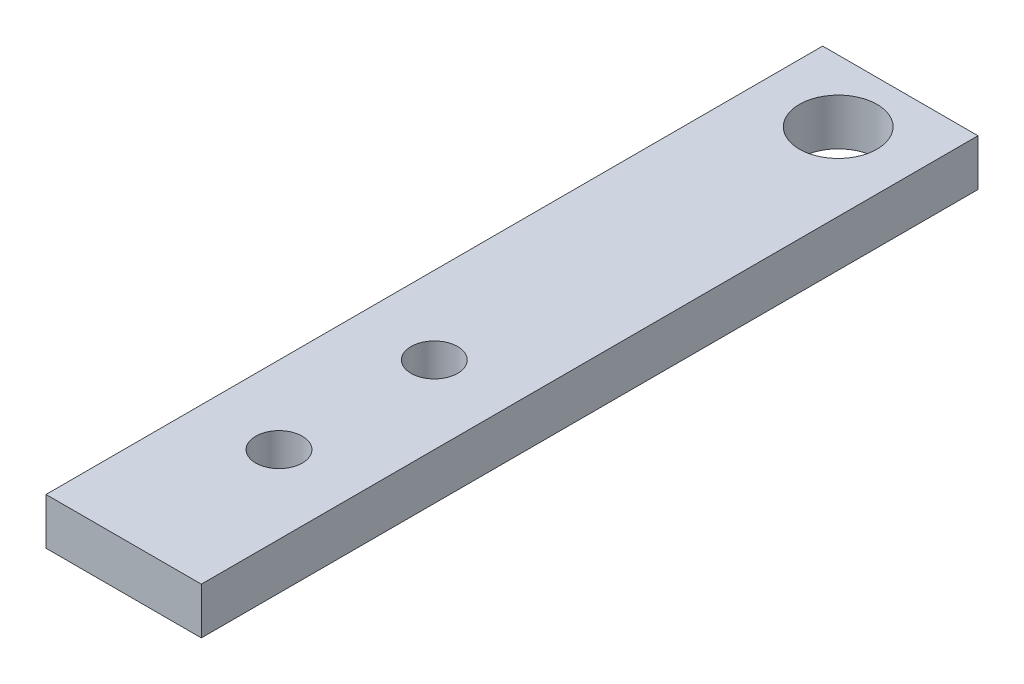
ISO-10303-21;
HEADER;
FILE_DESCRIPTION(('STEP AP214'),'2;1');
FILE_NAME('part.step','',(''),(''),'','','');
FILE_SCHEMA(('AUTOMOTIVE_DESIGN { 1 0 10303 214 1 1 1 1 }'));
ENDSEC;
DATA;
#1=APPLICATION_CONTEXT('core data for automotive mechanical design processes');
#2=APPLICATION_PROTOCOL_DEFINITION('international standard','automotive_design',2000,#1);
#3=PRODUCT_CONTEXT('',#1,'mechanical');
#4=PRODUCT('Part','Part','',(#3));
#5=PRODUCT_RELATED_PRODUCT_CATEGORY('part','',(#4));
#6=PRODUCT_DEFINITION_FORMATION('','',#4);
#7=PRODUCT_DEFINITION_CONTEXT('part definition',#1,'design');
#8=PRODUCT_DEFINITION('design','',#6,#7);
#9=PRODUCT_DEFINITION_SHAPE('','',#8);
#10=(LENGTH_UNIT() NAMED_UNIT(*) SI_UNIT(.MILLI.,.METRE.));
#11=(NAMED_UNIT(*) PLANE_ANGLE_UNIT() SI_UNIT($,.RADIAN.));
#12=(NAMED_UNIT(*) SI_UNIT($,.STERADIAN.) SOLID_ANGLE_UNIT());
#13=UNCERTAINTY_MEASURE_WITH_UNIT(LENGTH_MEASURE(1.E-05),#10,'distance_accuracy_value','');
#14=(GEOMETRIC_REPRESENTATION_CONTEXT(3) GLOBAL_UNCERTAINTY_ASSIGNED_CONTEXT((#13)) GLOBAL_UNIT_ASSIGNED_CONTEXT((#10,
#11,#12)) REPRESENTATION_CONTEXT('',''));
#15=CARTESIAN_POINT('',(0.,0.,0.));
#16=DIRECTION('',(0.,0.,1.));
#17=DIRECTION('',(1.,0.,0.));
#18=AXIS2_PLACEMENT_3D('',#15,#16,#17);
#19=CARTESIAN_POINT('',(0.,3.,0.));
#20=DIRECTION('',(0.,1.,0.));
#21=DIRECTION('',(0.,0.,1.));
#22=AXIS2_PLACEMENT_3D('',#19,#20,#21);
#23=PLANE('',#22);
#24=CARTESIAN_POINT('',(0.,3.,5.));
#25=DIRECTION('',(0.,1.,0.));
#26=DIRECTION('',(0.,0.,1.));
#27=AXIS2_PLACEMENT_3D('',#24,#25,#26);
#28=CIRCLE('',#27,1.5);
#29=CARTESIAN_POINT('',(0.,3.,6.5));
#30=VERTEX_POINT('',#29);
#31=EDGE_CURVE('E117',#30,#30,#28,.T.);
#32=ORIENTED_EDGE('',*,*,#31,.F.);
#33=EDGE_LOOP('',(#32));
#34=FACE_BOUND('',#33,.T.);
#35=DIRECTION('',(0.,0.,-1.));
#36=VECTOR('',#35,1.);
#37=CARTESIAN_POINT('',(5.,3.,-25.));
#38=LINE('',#37,#36);
#39=CARTESIAN_POINT('',(5.,3.,25.));
#40=VERTEX_POINT('',#39);
#41=CARTESIAN_POINT('',(5.,3.,-25.));
#42=VERTEX_POINT('',#41);
#43=EDGE_CURVE('E87',#40,#42,#38,.T.);
#44=ORIENTED_EDGE('',*,*,#43,.T.);
#45=DIRECTION('',(-1.,0.,0.));
#46=VECTOR('',#45,1.);
#47=CARTESIAN_POINT('',(-5.,3.,-25.));
#48=LINE('',#47,#46);
#49=CARTESIAN_POINT('',(-5.,3.,-25.));
#50=VERTEX_POINT('',#49);
#51=EDGE_CURVE('E82',#42,#50,#48,.T.);
#52=ORIENTED_EDGE('',*,*,#51,.T.);
#53=DIRECTION('',(0.,0.,1.));
#54=VECTOR('',#53,1.);
#55=CARTESIAN_POINT('',(-5.,3.,-25.));
#56=LINE('',#55,#54);
#57=CARTESIAN_POINT('',(-5.,3.,25.));
#58=VERTEX_POINT('',#57);
#59=EDGE_CURVE('E85',#50,#58,#56,.T.);
#60=ORIENTED_EDGE('',*,*,#59,.T.);
#61=DIRECTION('',(1.,0.,0.));
#62=VECTOR('',#61,1.);
#63=CARTESIAN_POINT('',(-5.,3.,25.));
#64=LINE('',#63,#62);
#65=EDGE_CURVE('E52',#58,#40,#64,.T.);
#66=ORIENTED_EDGE('',*,*,#65,.T.);
#67=EDGE_LOOP('',(#44,#52,#60,#66));
#68=FACE_BOUND('',#67,.T.);
#69=CARTESIAN_POINT('',(0.,3.,15.));
#70=DIRECTION('',(0.,1.,0.));
#71=DIRECTION('',(0.,0.,1.));
#72=AXIS2_PLACEMENT_3D('',#69,#70,#71);
#73=CIRCLE('',#72,1.5);
#74=CARTESIAN_POINT('',(0.,3.,16.5));
#75=VERTEX_POINT('',#74);
#76=EDGE_CURVE('E102',#75,#75,#73,.T.);
#77=ORIENTED_EDGE('',*,*,#76,.F.);
#78=EDGE_LOOP('',(#77));
#79=FACE_BOUND('',#78,.T.);
#80=CARTESIAN_POINT('',(0.,3.,-21.));
#81=DIRECTION('',(0.,1.,0.));
#82=DIRECTION('',(0.,0.,1.));
#83=AXIS2_PLACEMENT_3D('',#80,#81,#82);
#84=CIRCLE('',#83,2.5);
#85=CARTESIAN_POINT('',(0.,3.,-18.5));
#86=VERTEX_POINT('',#85);
#87=EDGE_CURVE('E123',#86,#86,#84,.T.);
#88=ORIENTED_EDGE('',*,*,#87,.F.);
#89=EDGE_LOOP('',(#88));
#90=FACE_BOUND('',#89,.T.);
#91=ADVANCED_FACE('F35',(#34,#68,#79,#90),#23,.T.);
#92=CARTESIAN_POINT('',(0.,0.,0.));
#93=DIRECTION('',(0.,1.,0.));
#94=DIRECTION('',(0.,0.,1.));
#95=AXIS2_PLACEMENT_3D('',#92,#93,#94);
#96=PLANE('',#95);
#97=CARTESIAN_POINT('',(0.,0.,5.));
#98=DIRECTION('',(0.,1.,0.));
#99=DIRECTION('',(0.,0.,1.));
#100=AXIS2_PLACEMENT_3D('',#97,#98,#99);
#101=CIRCLE('',#100,1.5);
#102=CARTESIAN_POINT('',(0.,0.,6.5));
#103=VERTEX_POINT('',#102);
#104=EDGE_CURVE('E120',#103,#103,#101,.T.);
#105=ORIENTED_EDGE('',*,*,#104,.T.);
#106=EDGE_LOOP('',(#105));
#107=FACE_BOUND('',#106,.T.);
#108=DIRECTION('',(0.,0.,-1.));
#109=VECTOR('',#108,1.);
#110=CARTESIAN_POINT('',(5.,0.,-25.));
#111=LINE('',#110,#109);
#112=CARTESIAN_POINT('',(5.,0.,25.));
#113=VERTEX_POINT('',#112);
#114=CARTESIAN_POINT('',(5.,0.,-25.));
#115=VERTEX_POINT('',#114);
#116=EDGE_CURVE('E99',#113,#115,#111,.T.);
#117=ORIENTED_EDGE('',*,*,#116,.F.);
#118=DIRECTION('',(1.,0.,0.));
#119=VECTOR('',#118,1.);
#120=CARTESIAN_POINT('',(-5.,0.,25.));
#121=LINE('',#120,#119);
#122=CARTESIAN_POINT('',(-5.,0.,25.));
#123=VERTEX_POINT('',#122);
#124=EDGE_CURVE('E75',#123,#113,#121,.T.);
#125=ORIENTED_EDGE('',*,*,#124,.F.);
#126=DIRECTION('',(0.,0.,1.));
#127=VECTOR('',#126,1.);
#128=CARTESIAN_POINT('',(-5.,0.,-25.));
#129=LINE('',#128,#127);
#130=CARTESIAN_POINT('',(-5.,0.,-25.));
#131=VERTEX_POINT('',#130);
#132=EDGE_CURVE('E69',#131,#123,#129,.T.);
#133=ORIENTED_EDGE('',*,*,#132,.F.);
#134=DIRECTION('',(-1.,0.,0.));
#135=VECTOR('',#134,1.);
#136=CARTESIAN_POINT('',(-5.,0.,-25.));
#137=LINE('',#136,#135);
#138=EDGE_CURVE('E91',#115,#131,#137,.T.);
#139=ORIENTED_EDGE('',*,*,#138,.F.);
#140=EDGE_LOOP('',(#117,#125,#133,#139));
#141=FACE_BOUND('',#140,.T.);
#142=CARTESIAN_POINT('',(0.,0.,15.));
#143=DIRECTION('',(0.,1.,0.));
#144=DIRECTION('',(0.,0.,1.));
#145=AXIS2_PLACEMENT_3D('',#142,#143,#144);
#146=CIRCLE('',#145,1.5);
#147=CARTESIAN_POINT('',(0.,0.,16.5));
#148=VERTEX_POINT('',#147);
#149=EDGE_CURVE('E114',#148,#148,#146,.T.);
#150=ORIENTED_EDGE('',*,*,#149,.T.);
#151=EDGE_LOOP('',(#150));
#152=FACE_BOUND('',#151,.T.);
#153=CARTESIAN_POINT('',(0.,0.,-21.));
#154=DIRECTION('',(0.,1.,0.));
#155=DIRECTION('',(0.,0.,1.));
#156=AXIS2_PLACEMENT_3D('',#153,#154,#155);
#157=CIRCLE('',#156,2.5);
#158=CARTESIAN_POINT('',(0.,0.,-18.5));
#159=VERTEX_POINT('',#158);
#160=EDGE_CURVE('E126',#159,#159,#157,.T.);
#161=ORIENTED_EDGE('',*,*,#160,.T.);
#162=EDGE_LOOP('',(#161));
#163=FACE_BOUND('',#162,.T.);
#164=ADVANCED_FACE('F110',(#107,#141,#152,#163),#96,.F.);
#165=CARTESIAN_POINT('',(5.,3.,-25.));
#166=DIRECTION('',(-1.,0.,0.));
#167=DIRECTION('',(0.,0.,1.));
#168=AXIS2_PLACEMENT_3D('',#165,#166,#167);
#169=PLANE('',#168);
#170=ORIENTED_EDGE('',*,*,#116,.T.);
#171=DIRECTION('',(0.,-1.,0.));
#172=VECTOR('',#171,1.);
#173=CARTESIAN_POINT('',(5.,3.,-25.));
#174=LINE('',#173,#172);
#175=EDGE_CURVE('E11',#42,#115,#174,.T.);
#176=ORIENTED_EDGE('',*,*,#175,.F.);
#177=ORIENTED_EDGE('',*,*,#43,.F.);
#178=DIRECTION('',(0.,-1.,0.));
#179=VECTOR('',#178,1.);
#180=CARTESIAN_POINT('',(5.,3.,25.));
#181=LINE('',#180,#179);
#182=EDGE_CURVE('E95',#40,#113,#181,.T.);
#183=ORIENTED_EDGE('',*,*,#182,.T.);
#184=EDGE_LOOP('',(#170,#176,#177,#183));
#185=FACE_BOUND('',#184,.T.);
#186=ADVANCED_FACE('F37',(#185),#169,.F.);
#187=CARTESIAN_POINT('',(-5.,3.,-25.));
#188=DIRECTION('',(0.,0.,1.));
#189=DIRECTION('',(1.,0.,0.));
#190=AXIS2_PLACEMENT_3D('',#187,#188,#189);
#191=PLANE('',#190);
#192=ORIENTED_EDGE('',*,*,#138,.T.);
#193=DIRECTION('',(0.,-1.,0.));
#194=VECTOR('',#193,1.);
#195=CARTESIAN_POINT('',(-5.,3.,-25.));
#196=LINE('',#195,#194);
#197=EDGE_CURVE('E44',#50,#131,#196,.T.);
#198=ORIENTED_EDGE('',*,*,#197,.F.);
#199=ORIENTED_EDGE('',*,*,#51,.F.);
#200=ORIENTED_EDGE('',*,*,#175,.T.);
#201=EDGE_LOOP('',(#192,#198,#199,#200));
#202=FACE_BOUND('',#201,.T.);
#203=ADVANCED_FACE('F90',(#202),#191,.F.);
#204=CARTESIAN_POINT('',(-5.,3.,-25.));
#205=DIRECTION('',(1.,0.,0.));
#206=DIRECTION('',(0.,0.,-1.));
#207=AXIS2_PLACEMENT_3D('',#204,#205,#206);
#208=PLANE('',#207);
#209=ORIENTED_EDGE('',*,*,#132,.T.);
#210=DIRECTION('',(0.,-1.,0.));
#211=VECTOR('',#210,1.);
#212=CARTESIAN_POINT('',(-5.,3.,25.));
#213=LINE('',#212,#211);
#214=EDGE_CURVE('E92',#58,#123,#213,.T.);
#215=ORIENTED_EDGE('',*,*,#214,.F.);
#216=ORIENTED_EDGE('',*,*,#59,.F.);
#217=ORIENTED_EDGE('',*,*,#197,.T.);
#218=EDGE_LOOP('',(#209,#215,#216,#217));
#219=FACE_BOUND('',#218,.T.);
#220=ADVANCED_FACE('F93',(#219),#208,.F.);
#221=CARTESIAN_POINT('',(-5.,3.,25.));
#222=DIRECTION('',(0.,0.,-1.));
#223=DIRECTION('',(-1.,0.,0.));
#224=AXIS2_PLACEMENT_3D('',#221,#222,#223);
#225=PLANE('',#224);
#226=ORIENTED_EDGE('',*,*,#124,.T.);
#227=ORIENTED_EDGE('',*,*,#182,.F.);
#228=ORIENTED_EDGE('',*,*,#65,.F.);
#229=ORIENTED_EDGE('',*,*,#214,.T.);
#230=EDGE_LOOP('',(#226,#227,#228,#229));
#231=FACE_BOUND('',#230,.T.);
#232=ADVANCED_FACE('F107',(#231),#225,.F.);
#233=CARTESIAN_POINT('',(0.,3.,15.));
#234=DIRECTION('',(0.,-1.,0.));
#235=DIRECTION('',(0.,0.,-1.));
#236=AXIS2_PLACEMENT_3D('',#233,#234,#235);
#237=CYLINDRICAL_SURFACE('',#236,1.5);
#238=ORIENTED_EDGE('',*,*,#76,.T.);
#239=EDGE_LOOP('',(#238));
#240=FACE_BOUND('',#239,.T.);
#241=ORIENTED_EDGE('',*,*,#149,.F.);
#242=EDGE_LOOP('',(#241));
#243=FACE_BOUND('',#242,.T.);
#244=ADVANCED_FACE('F145',(#240,#243),#237,.F.);
#245=CARTESIAN_POINT('',(0.,3.,5.));
#246=DIRECTION('',(0.,-1.,0.));
#247=DIRECTION('',(0.,0.,-1.));
#248=AXIS2_PLACEMENT_3D('',#245,#246,#247);
#249=CYLINDRICAL_SURFACE('',#248,1.5);
#250=ORIENTED_EDGE('',*,*,#31,.T.);
#251=EDGE_LOOP('',(#250));
#252=FACE_BOUND('',#251,.T.);
#253=ORIENTED_EDGE('',*,*,#104,.F.);
#254=EDGE_LOOP('',(#253));
#255=FACE_BOUND('',#254,.T.);
#256=ADVANCED_FACE('F191',(#252,#255),#249,.F.);
#257=CARTESIAN_POINT('',(0.,3.,-21.));
#258=DIRECTION('',(0.,-1.,0.));
#259=DIRECTION('',(0.,0.,-1.));
#260=AXIS2_PLACEMENT_3D('',#257,#258,#259);
#261=CYLINDRICAL_SURFACE('',#260,2.5);
#262=ORIENTED_EDGE('',*,*,#87,.T.);
#263=EDGE_LOOP('',(#262));
#264=FACE_BOUND('',#263,.T.);
#265=ORIENTED_EDGE('',*,*,#160,.F.);
#266=EDGE_LOOP('',(#265));
#267=FACE_BOUND('',#266,.T.);
#268=ADVANCED_FACE('F132',(#264,#267),#261,.F.);
#269=CLOSED_SHELL('',(#91,#164,#186,#203,#220,#232,#244,#256,#268));
#270=MANIFOLD_SOLID_BREP('B2',#269);
#271=ADVANCED_BREP_SHAPE_REPRESENTATION('',(#18,#270),#14);
#272=SHAPE_DEFINITION_REPRESENTATION(#9,#271);
ENDSEC;
END-ISO-10303-21;
